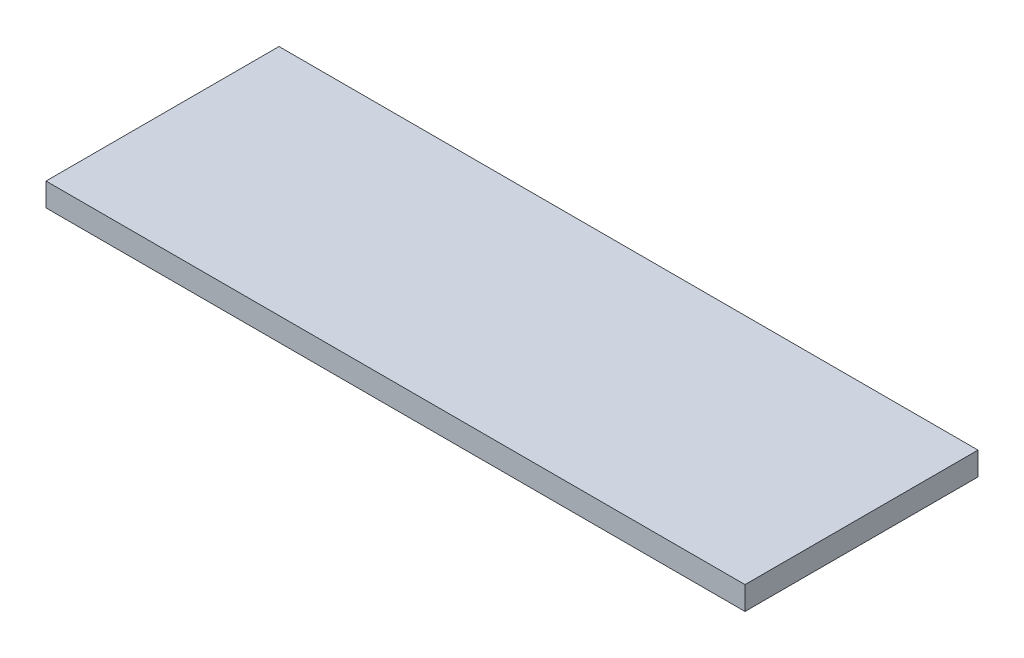
ISO-10303-21;
HEADER;
FILE_DESCRIPTION(('STEP AP214'),'2;1');
FILE_NAME('part.step','',(''),(''),'','','');
FILE_SCHEMA(('AUTOMOTIVE_DESIGN { 1 0 10303 214 1 1 1 1 }'));
ENDSEC;
DATA;
#1=APPLICATION_CONTEXT('core data for automotive mechanical design processes');
#2=APPLICATION_PROTOCOL_DEFINITION('international standard','automotive_design',2000,#1);
#3=PRODUCT_CONTEXT('',#1,'mechanical');
#4=PRODUCT('Part','Part','',(#3));
#5=PRODUCT_RELATED_PRODUCT_CATEGORY('part','',(#4));
#6=PRODUCT_DEFINITION_FORMATION('','',#4);
#7=PRODUCT_DEFINITION_CONTEXT('part definition',#1,'design');
#8=PRODUCT_DEFINITION('design','',#6,#7);
#9=PRODUCT_DEFINITION_SHAPE('','',#8);
#10=(LENGTH_UNIT() NAMED_UNIT(*) SI_UNIT(.MILLI.,.METRE.));
#11=(NAMED_UNIT(*) PLANE_ANGLE_UNIT() SI_UNIT($,.RADIAN.));
#12=(NAMED_UNIT(*) SI_UNIT($,.STERADIAN.) SOLID_ANGLE_UNIT());
#13=UNCERTAINTY_MEASURE_WITH_UNIT(LENGTH_MEASURE(1.E-05),#10,'distance_accuracy_value','');
#14=(GEOMETRIC_REPRESENTATION_CONTEXT(3) GLOBAL_UNCERTAINTY_ASSIGNED_CONTEXT((#13)) GLOBAL_UNIT_ASSIGNED_CONTEXT((#10,
#11,#12)) REPRESENTATION_CONTEXT('',''));
#15=CARTESIAN_POINT('',(0.,0.,0.));
#16=DIRECTION('',(0.,0.,1.));
#17=DIRECTION('',(1.,0.,0.));
#18=AXIS2_PLACEMENT_3D('',#15,#16,#17);
#19=CARTESIAN_POINT('',(75.,5.,-25.));
#20=DIRECTION('',(-1.,0.,0.));
#21=DIRECTION('',(0.,0.,1.));
#22=AXIS2_PLACEMENT_3D('',#19,#20,#21);
#23=PLANE('',#22);
#24=DIRECTION('',(0.,0.,-1.));
#25=VECTOR('',#24,1.);
#26=CARTESIAN_POINT('',(75.,0.,-25.));
#27=LINE('',#26,#25);
#28=CARTESIAN_POINT('',(75.,0.,25.));
#29=VERTEX_POINT('',#28);
#30=CARTESIAN_POINT('',(75.,0.,-25.));
#31=VERTEX_POINT('',#30);
#32=EDGE_CURVE('E98',#29,#31,#27,.T.);
#33=ORIENTED_EDGE('',*,*,#32,.T.);
#34=DIRECTION('',(0.,-1.,0.));
#35=VECTOR('',#34,1.);
#36=CARTESIAN_POINT('',(75.,5.,-25.));
#37=LINE('',#36,#35);
#38=CARTESIAN_POINT('',(75.,5.,-25.));
#39=VERTEX_POINT('',#38);
#40=EDGE_CURVE('E11',#39,#31,#37,.T.);
#41=ORIENTED_EDGE('',*,*,#40,.F.);
#42=DIRECTION('',(0.,0.,-1.));
#43=VECTOR('',#42,1.);
#44=CARTESIAN_POINT('',(75.,5.,-25.));
#45=LINE('',#44,#43);
#46=CARTESIAN_POINT('',(75.,5.,25.));
#47=VERTEX_POINT('',#46);
#48=EDGE_CURVE('E86',#47,#39,#45,.T.);
#49=ORIENTED_EDGE('',*,*,#48,.F.);
#50=DIRECTION('',(0.,-1.,0.));
#51=VECTOR('',#50,1.);
#52=CARTESIAN_POINT('',(75.,5.,25.));
#53=LINE('',#52,#51);
#54=EDGE_CURVE('E94',#47,#29,#53,.T.);
#55=ORIENTED_EDGE('',*,*,#54,.T.);
#56=EDGE_LOOP('',(#33,#41,#49,#55));
#57=FACE_BOUND('',#56,.T.);
#58=ADVANCED_FACE('F35',(#57),#23,.F.);
#59=CARTESIAN_POINT('',(-75.,5.,-25.));
#60=DIRECTION('',(0.,0.,1.));
#61=DIRECTION('',(1.,0.,0.));
#62=AXIS2_PLACEMENT_3D('',#59,#60,#61);
#63=PLANE('',#62);
#64=DIRECTION('',(-1.,0.,0.));
#65=VECTOR('',#64,1.);
#66=CARTESIAN_POINT('',(-75.,0.,-25.));
#67=LINE('',#66,#65);
#68=CARTESIAN_POINT('',(-75.,0.,-25.));
#69=VERTEX_POINT('',#68);
#70=EDGE_CURVE('E90',#31,#69,#67,.T.);
#71=ORIENTED_EDGE('',*,*,#70,.T.);
#72=DIRECTION('',(0.,-1.,0.));
#73=VECTOR('',#72,1.);
#74=CARTESIAN_POINT('',(-75.,5.,-25.));
#75=LINE('',#74,#73);
#76=CARTESIAN_POINT('',(-75.,5.,-25.));
#77=VERTEX_POINT('',#76);
#78=EDGE_CURVE('E43',#77,#69,#75,.T.);
#79=ORIENTED_EDGE('',*,*,#78,.F.);
#80=DIRECTION('',(-1.,0.,0.));
#81=VECTOR('',#80,1.);
#82=CARTESIAN_POINT('',(-75.,5.,-25.));
#83=LINE('',#82,#81);
#84=EDGE_CURVE('E81',#39,#77,#83,.T.);
#85=ORIENTED_EDGE('',*,*,#84,.F.);
#86=ORIENTED_EDGE('',*,*,#40,.T.);
#87=EDGE_LOOP('',(#71,#79,#85,#86));
#88=FACE_BOUND('',#87,.T.);
#89=ADVANCED_FACE('F89',(#88),#63,.F.);
#90=CARTESIAN_POINT('',(-75.,5.,-25.));
#91=DIRECTION('',(1.,0.,0.));
#92=DIRECTION('',(0.,0.,-1.));
#93=AXIS2_PLACEMENT_3D('',#90,#91,#92);
#94=PLANE('',#93);
#95=DIRECTION('',(0.,0.,1.));
#96=VECTOR('',#95,1.);
#97=CARTESIAN_POINT('',(-75.,0.,-25.));
#98=LINE('',#97,#96);
#99=CARTESIAN_POINT('',(-75.,0.,25.));
#100=VERTEX_POINT('',#99);
#101=EDGE_CURVE('E68',#69,#100,#98,.T.);
#102=ORIENTED_EDGE('',*,*,#101,.T.);
#103=DIRECTION('',(0.,-1.,0.));
#104=VECTOR('',#103,1.);
#105=CARTESIAN_POINT('',(-75.,5.,25.));
#106=LINE('',#105,#104);
#107=CARTESIAN_POINT('',(-75.,5.,25.));
#108=VERTEX_POINT('',#107);
#109=EDGE_CURVE('E91',#108,#100,#106,.T.);
#110=ORIENTED_EDGE('',*,*,#109,.F.);
#111=DIRECTION('',(0.,0.,1.));
#112=VECTOR('',#111,1.);
#113=CARTESIAN_POINT('',(-75.,5.,-25.));
#114=LINE('',#113,#112);
#115=EDGE_CURVE('E84',#77,#108,#114,.T.);
#116=ORIENTED_EDGE('',*,*,#115,.F.);
#117=ORIENTED_EDGE('',*,*,#78,.T.);
#118=EDGE_LOOP('',(#102,#110,#116,#117));
#119=FACE_BOUND('',#118,.T.);
#120=ADVANCED_FACE('F92',(#119),#94,.F.);
#121=CARTESIAN_POINT('',(-75.,5.,25.));
#122=DIRECTION('',(0.,0.,-1.));
#123=DIRECTION('',(-1.,0.,0.));
#124=AXIS2_PLACEMENT_3D('',#121,#122,#123);
#125=PLANE('',#124);
#126=DIRECTION('',(1.,0.,0.));
#127=VECTOR('',#126,1.);
#128=CARTESIAN_POINT('',(-75.,0.,25.));
#129=LINE('',#128,#127);
#130=EDGE_CURVE('E74',#100,#29,#129,.T.);
#131=ORIENTED_EDGE('',*,*,#130,.T.);
#132=ORIENTED_EDGE('',*,*,#54,.F.);
#133=DIRECTION('',(1.,0.,0.));
#134=VECTOR('',#133,1.);
#135=CARTESIAN_POINT('',(-75.,5.,25.));
#136=LINE('',#135,#134);
#137=EDGE_CURVE('E51',#108,#47,#136,.T.);
#138=ORIENTED_EDGE('',*,*,#137,.F.);
#139=ORIENTED_EDGE('',*,*,#109,.T.);
#140=EDGE_LOOP('',(#131,#132,#138,#139));
#141=FACE_BOUND('',#140,.T.);
#142=ADVANCED_FACE('F105',(#141),#125,.F.);
#143=CARTESIAN_POINT('',(0.,5.,0.));
#144=DIRECTION('',(0.,1.,0.));
#145=DIRECTION('',(0.,0.,1.));
#146=AXIS2_PLACEMENT_3D('',#143,#144,#145);
#147=PLANE('',#146);
#148=ORIENTED_EDGE('',*,*,#48,.T.);
#149=ORIENTED_EDGE('',*,*,#84,.T.);
#150=ORIENTED_EDGE('',*,*,#115,.T.);
#151=ORIENTED_EDGE('',*,*,#137,.T.);
#152=EDGE_LOOP('',(#148,#149,#150,#151));
#153=FACE_BOUND('',#152,.T.);
#154=ADVANCED_FACE('F82',(#153),#147,.T.);
#155=CARTESIAN_POINT('',(0.,0.,0.));
#156=DIRECTION('',(0.,1.,0.));
#157=DIRECTION('',(0.,0.,1.));
#158=AXIS2_PLACEMENT_3D('',#155,#156,#157);
#159=PLANE('',#158);
#160=ORIENTED_EDGE('',*,*,#32,.F.);
#161=ORIENTED_EDGE('',*,*,#130,.F.);
#162=ORIENTED_EDGE('',*,*,#101,.F.);
#163=ORIENTED_EDGE('',*,*,#70,.F.);
#164=EDGE_LOOP('',(#160,#161,#162,#163));
#165=FACE_BOUND('',#164,.T.);
#166=ADVANCED_FACE('F108',(#165),#159,.F.);
#167=CLOSED_SHELL('',(#58,#89,#120,#142,#154,#166));
#168=MANIFOLD_SOLID_BREP('B2',#167);
#169=ADVANCED_BREP_SHAPE_REPRESENTATION('',(#18,#168),#14);
#170=SHAPE_DEFINITION_REPRESENTATION(#9,#169);
ENDSEC;
END-ISO-10303-21;
